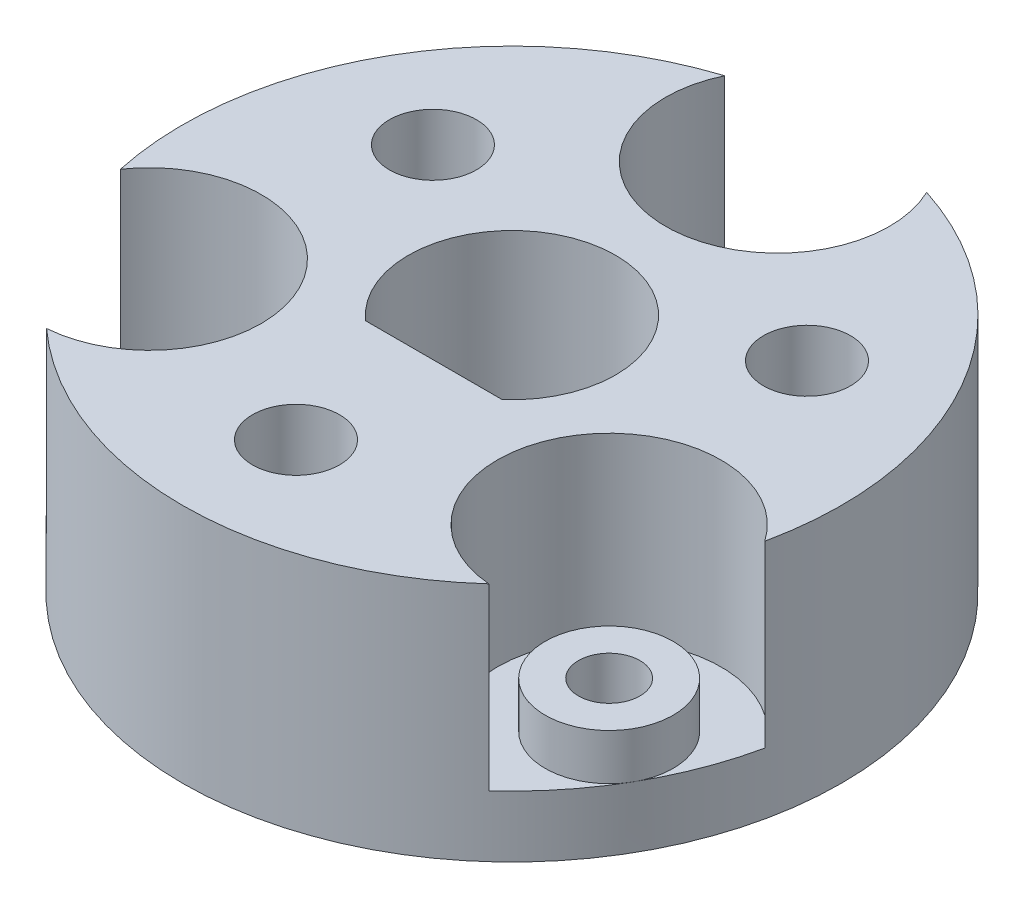
ISO-10303-21;
HEADER;
FILE_DESCRIPTION(('STEP AP214'),'2;1');
FILE_NAME('part.step','',(''),(''),'','','');
FILE_SCHEMA(('AUTOMOTIVE_DESIGN { 1 0 10303 214 1 1 1 1 }'));
ENDSEC;
DATA;
#1=APPLICATION_CONTEXT('core data for automotive mechanical design processes');
#2=APPLICATION_PROTOCOL_DEFINITION('international standard','automotive_design',2000,#1);
#3=PRODUCT_CONTEXT('',#1,'mechanical');
#4=PRODUCT('Part','Part','',(#3));
#5=PRODUCT_RELATED_PRODUCT_CATEGORY('part','',(#4));
#6=PRODUCT_DEFINITION_FORMATION('','',#4);
#7=PRODUCT_DEFINITION_CONTEXT('part definition',#1,'design');
#8=PRODUCT_DEFINITION('design','',#6,#7);
#9=PRODUCT_DEFINITION_SHAPE('','',#8);
#10=(LENGTH_UNIT() NAMED_UNIT(*) SI_UNIT(.MILLI.,.METRE.));
#11=(NAMED_UNIT(*) PLANE_ANGLE_UNIT() SI_UNIT($,.RADIAN.));
#12=(NAMED_UNIT(*) SI_UNIT($,.STERADIAN.) SOLID_ANGLE_UNIT());
#13=UNCERTAINTY_MEASURE_WITH_UNIT(LENGTH_MEASURE(1.E-05),#10,'distance_accuracy_value','');
#14=(GEOMETRIC_REPRESENTATION_CONTEXT(3) GLOBAL_UNCERTAINTY_ASSIGNED_CONTEXT((#13)) GLOBAL_UNIT_ASSIGNED_CONTEXT((#10,
#11,#12)) REPRESENTATION_CONTEXT('',''));
#15=CARTESIAN_POINT('',(0.,0.,0.));
#16=DIRECTION('',(0.,0.,1.));
#17=DIRECTION('',(1.,0.,0.));
#18=AXIS2_PLACEMENT_3D('',#15,#16,#17);
#19=CARTESIAN_POINT('',(0.,3.5,0.));
#20=DIRECTION('',(0.,1.,0.));
#21=DIRECTION('',(0.,0.,1.));
#22=AXIS2_PLACEMENT_3D('',#19,#20,#21);
#23=PLANE('',#22);
#24=CARTESIAN_POINT('',(-3.65246214046086,3.5,-2.10875000000002));
#25=DIRECTION('',(0.,1.,0.));
#26=DIRECTION('',(0.,0.,1.));
#27=AXIS2_PLACEMENT_3D('',#24,#25,#26);
#28=CIRCLE('',#27,0.849999950999999);
#29=CARTESIAN_POINT('',(-3.65246214046086,3.5,-1.25875004900002));
#30=VERTEX_POINT('',#29);
#31=EDGE_CURVE('E49',#30,#30,#28,.T.);
#32=ORIENTED_EDGE('',*,*,#31,.F.);
#33=EDGE_LOOP('',(#32));
#34=FACE_BOUND('',#33,.T.);
#35=CARTESIAN_POINT('',(3.65246214046086,3.5,-2.10875000000002));
#36=DIRECTION('',(0.,1.,0.));
#37=DIRECTION('',(0.,0.,1.));
#38=AXIS2_PLACEMENT_3D('',#35,#36,#37);
#39=CIRCLE('',#38,0.849999950999999);
#40=CARTESIAN_POINT('',(3.65246214046086,3.5,-1.25875004900002));
#41=VERTEX_POINT('',#40);
#42=EDGE_CURVE('E222',#41,#41,#39,.T.);
#43=ORIENTED_EDGE('',*,*,#42,.F.);
#44=EDGE_LOOP('',(#43));
#45=FACE_BOUND('',#44,.T.);
#46=CARTESIAN_POINT('',(0.,3.5,4.2175));
#47=DIRECTION('',(0.,1.,0.));
#48=DIRECTION('',(0.,0.,1.));
#49=AXIS2_PLACEMENT_3D('',#46,#47,#48);
#50=CIRCLE('',#49,0.849999950999999);
#51=CARTESIAN_POINT('',(0.,3.5,5.067499951));
#52=VERTEX_POINT('',#51);
#53=EDGE_CURVE('E132',#52,#52,#50,.T.);
#54=ORIENTED_EDGE('',*,*,#53,.F.);
#55=EDGE_LOOP('',(#54));
#56=FACE_BOUND('',#55,.T.);
#57=CARTESIAN_POINT('',(0.,3.5,0.));
#58=DIRECTION('',(0.,1.,0.));
#59=DIRECTION('',(0.,0.,1.));
#60=AXIS2_PLACEMENT_3D('',#57,#58,#59);
#61=CIRCLE('',#60,6.435);
#62=CARTESIAN_POINT('',(6.29081904106016,3.5,1.3545555701539));
#63=VERTEX_POINT('',#62);
#64=CARTESIAN_POINT('',(1.97232998593911,3.5,-6.1252868852459));
#65=VERTEX_POINT('',#64);
#66=EDGE_CURVE('E180',#63,#65,#61,.T.);
#67=ORIENTED_EDGE('',*,*,#66,.T.);
#68=CARTESIAN_POINT('',(0.,3.5,-5.185));
#69=DIRECTION('',(0.,1.,0.));
#70=DIRECTION('',(0.,0.,1.));
#71=AXIS2_PLACEMENT_3D('',#68,#69,#70);
#72=CIRCLE('',#71,2.185);
#73=CARTESIAN_POINT('',(-1.97232998593911,3.5,-6.1252868852459));
#74=VERTEX_POINT('',#73);
#75=EDGE_CURVE('E182',#74,#65,#72,.T.);
#76=ORIENTED_EDGE('',*,*,#75,.F.);
#77=CARTESIAN_POINT('',(0.,3.5,0.));
#78=DIRECTION('',(0.,1.,0.));
#79=DIRECTION('',(0.,0.,1.));
#80=AXIS2_PLACEMENT_3D('',#77,#78,#79);
#81=CIRCLE('',#80,6.435);
#82=CARTESIAN_POINT('',(-6.29081904106016,3.5,1.35455557015391));
#83=VERTEX_POINT('',#82);
#84=EDGE_CURVE('E186',#74,#83,#81,.T.);
#85=ORIENTED_EDGE('',*,*,#84,.T.);
#86=CARTESIAN_POINT('',(-4.4903417186223,3.5,2.59250000000002));
#87=DIRECTION('',(0.,1.,0.));
#88=DIRECTION('',(0.,0.,1.));
#89=AXIS2_PLACEMENT_3D('',#86,#87,#88);
#90=CIRCLE('',#89,2.185);
#91=CARTESIAN_POINT('',(-4.31848905512103,3.5,4.77073131509204));
#92=VERTEX_POINT('',#91);
#93=EDGE_CURVE('E188',#92,#83,#90,.T.);
#94=ORIENTED_EDGE('',*,*,#93,.F.);
#95=CARTESIAN_POINT('',(0.,3.5,0.));
#96=DIRECTION('',(0.,1.,0.));
#97=DIRECTION('',(0.,0.,1.));
#98=AXIS2_PLACEMENT_3D('',#95,#96,#97);
#99=CIRCLE('',#98,6.435);
#100=CARTESIAN_POINT('',(4.31848905512103,3.5,4.77073131509205));
#101=VERTEX_POINT('',#100);
#102=EDGE_CURVE('E191',#92,#101,#99,.T.);
#103=ORIENTED_EDGE('',*,*,#102,.T.);
#104=CARTESIAN_POINT('',(4.4903417186223,3.5,2.59250000000002));
#105=DIRECTION('',(0.,1.,0.));
#106=DIRECTION('',(0.,0.,1.));
#107=AXIS2_PLACEMENT_3D('',#104,#105,#106);
#108=CIRCLE('',#107,2.185);
#109=EDGE_CURVE('E193',#63,#101,#108,.T.);
#110=ORIENTED_EDGE('',*,*,#109,.F.);
#111=EDGE_LOOP('',(#67,#76,#85,#94,#103,#110));
#112=FACE_BOUND('',#111,.T.);
#113=CARTESIAN_POINT('',(0.,3.5,0.));
#114=DIRECTION('',(0.,1.,0.));
#115=DIRECTION('',(0.,0.,1.));
#116=AXIS2_PLACEMENT_3D('',#113,#114,#115);
#117=CIRCLE('',#116,2.025);
#118=CARTESIAN_POINT('',(1.33229125944742,3.5,1.525));
#119=VERTEX_POINT('',#118);
#120=CARTESIAN_POINT('',(-1.33229125944742,3.5,1.525));
#121=VERTEX_POINT('',#120);
#122=EDGE_CURVE('E123',#119,#121,#117,.T.);
#123=ORIENTED_EDGE('',*,*,#122,.F.);
#124=DIRECTION('',(-1.,0.,0.));
#125=VECTOR('',#124,1.);
#126=CARTESIAN_POINT('',(0.,3.5,1.525));
#127=LINE('',#126,#125);
#128=EDGE_CURVE('E121',#119,#121,#127,.T.);
#129=ORIENTED_EDGE('',*,*,#128,.T.);
#130=EDGE_LOOP('',(#123,#129));
#131=FACE_BOUND('',#130,.T.);
#132=ADVANCED_FACE('F45',(#34,#45,#56,#112,#131),#23,.T.);
#133=CARTESIAN_POINT('',(0.,-1.2,0.));
#134=DIRECTION('',(0.,-1.,0.));
#135=DIRECTION('',(0.,0.,-1.));
#136=AXIS2_PLACEMENT_3D('',#133,#134,#135);
#137=PLANE('',#136);
#138=CARTESIAN_POINT('',(0.,-1.2,0.));
#139=DIRECTION('',(0.,-1.,0.));
#140=DIRECTION('',(0.,0.,-1.));
#141=AXIS2_PLACEMENT_3D('',#138,#139,#140);
#142=CIRCLE('',#141,6.435);
#143=CARTESIAN_POINT('',(0.,-1.2,-6.435));
#144=VERTEX_POINT('',#143);
#145=EDGE_CURVE('E171',#144,#144,#142,.T.);
#146=ORIENTED_EDGE('',*,*,#145,.T.);
#147=EDGE_LOOP('',(#146));
#148=FACE_BOUND('',#147,.T.);
#149=CARTESIAN_POINT('',(0.,-1.2,0.));
#150=DIRECTION('',(0.,-1.,0.));
#151=DIRECTION('',(0.,0.,-1.));
#152=AXIS2_PLACEMENT_3D('',#149,#150,#151);
#153=CIRCLE('',#152,2.025);
#154=CARTESIAN_POINT('',(-1.33229125944742,-1.2,1.525));
#155=VERTEX_POINT('',#154);
#156=CARTESIAN_POINT('',(1.33229125944742,-1.2,1.525));
#157=VERTEX_POINT('',#156);
#158=EDGE_CURVE('E127',#155,#157,#153,.T.);
#159=ORIENTED_EDGE('',*,*,#158,.F.);
#160=DIRECTION('',(1.,0.,0.));
#161=VECTOR('',#160,1.);
#162=CARTESIAN_POINT('',(0.,-1.2,1.525));
#163=LINE('',#162,#161);
#164=EDGE_CURVE('E69',#155,#157,#163,.T.);
#165=ORIENTED_EDGE('',*,*,#164,.T.);
#166=EDGE_LOOP('',(#159,#165));
#167=FACE_BOUND('',#166,.T.);
#168=ADVANCED_FACE('F131',(#148,#167),#137,.T.);
#169=CARTESIAN_POINT('',(0.,3.5,-5.185));
#170=DIRECTION('',(0.,-1.,0.));
#171=DIRECTION('',(0.,0.,-1.));
#172=AXIS2_PLACEMENT_3D('',#169,#170,#171);
#173=CYLINDRICAL_SURFACE('',#172,2.185);
#174=CARTESIAN_POINT('',(0.,0.,-5.185));
#175=DIRECTION('',(0.,1.,0.));
#176=DIRECTION('',(0.,0.,1.));
#177=AXIS2_PLACEMENT_3D('',#174,#175,#176);
#178=CIRCLE('',#177,2.185);
#179=CARTESIAN_POINT('',(-1.97232998593911,0.,-6.1252868852459));
#180=VERTEX_POINT('',#179);
#181=CARTESIAN_POINT('',(1.9723299859391,0.,-6.1252868852459));
#182=VERTEX_POINT('',#181);
#183=EDGE_CURVE('E174',#180,#182,#178,.T.);
#184=ORIENTED_EDGE('',*,*,#183,.F.);
#185=DIRECTION('',(0.,-1.,0.));
#186=VECTOR('',#185,1.);
#187=CARTESIAN_POINT('',(-1.97232998593911,3.5,-6.1252868852459));
#188=LINE('',#187,#186);
#189=EDGE_CURVE('E213',#74,#180,#188,.T.);
#190=ORIENTED_EDGE('',*,*,#189,.F.);
#191=ORIENTED_EDGE('',*,*,#75,.T.);
#192=DIRECTION('',(0.,-1.,0.));
#193=VECTOR('',#192,1.);
#194=CARTESIAN_POINT('',(1.97232998593911,3.5,-6.1252868852459));
#195=LINE('',#194,#193);
#196=EDGE_CURVE('E215',#65,#182,#195,.T.);
#197=ORIENTED_EDGE('',*,*,#196,.T.);
#198=EDGE_LOOP('',(#184,#190,#191,#197));
#199=FACE_BOUND('',#198,.T.);
#200=ADVANCED_FACE('F47',(#199),#173,.F.);
#201=CARTESIAN_POINT('',(-4.4903417186223,3.5,2.59250000000002));
#202=DIRECTION('',(0.,-1.,0.));
#203=DIRECTION('',(0.,0.,-1.));
#204=AXIS2_PLACEMENT_3D('',#201,#202,#203);
#205=CYLINDRICAL_SURFACE('',#204,2.185);
#206=CARTESIAN_POINT('',(-4.4903417186223,0.,2.59250000000002));
#207=DIRECTION('',(0.,1.,0.));
#208=DIRECTION('',(0.,0.,1.));
#209=AXIS2_PLACEMENT_3D('',#206,#207,#208);
#210=CIRCLE('',#209,2.185);
#211=CARTESIAN_POINT('',(-4.31848905512103,0.,4.77073131509204));
#212=VERTEX_POINT('',#211);
#213=CARTESIAN_POINT('',(-6.29081904106016,0.,1.35455557015391));
#214=VERTEX_POINT('',#213);
#215=EDGE_CURVE('E199',#212,#214,#210,.T.);
#216=ORIENTED_EDGE('',*,*,#215,.F.);
#217=DIRECTION('',(0.,-1.,0.));
#218=VECTOR('',#217,1.);
#219=CARTESIAN_POINT('',(-4.31848905512103,3.5,4.77073131509204));
#220=LINE('',#219,#218);
#221=EDGE_CURVE('E208',#92,#212,#220,.T.);
#222=ORIENTED_EDGE('',*,*,#221,.F.);
#223=ORIENTED_EDGE('',*,*,#93,.T.);
#224=DIRECTION('',(0.,-1.,0.));
#225=VECTOR('',#224,1.);
#226=CARTESIAN_POINT('',(-6.29081904106016,3.5,1.35455557015391));
#227=LINE('',#226,#225);
#228=EDGE_CURVE('E210',#83,#214,#227,.T.);
#229=ORIENTED_EDGE('',*,*,#228,.T.);
#230=EDGE_LOOP('',(#216,#222,#223,#229));
#231=FACE_BOUND('',#230,.T.);
#232=ADVANCED_FACE('F269',(#231),#205,.F.);
#233=CARTESIAN_POINT('',(0.,3.5,0.));
#234=DIRECTION('',(0.,-1.,0.));
#235=DIRECTION('',(0.,0.,-1.));
#236=AXIS2_PLACEMENT_3D('',#233,#234,#235);
#237=CYLINDRICAL_SURFACE('',#236,6.435);
#238=ORIENTED_EDGE('',*,*,#221,.T.);
#239=CARTESIAN_POINT('',(0.,0.,0.));
#240=DIRECTION('',(0.,-1.,0.));
#241=DIRECTION('',(0.,0.,-1.));
#242=AXIS2_PLACEMENT_3D('',#239,#240,#241);
#243=CIRCLE('',#242,6.435);
#244=CARTESIAN_POINT('',(-5.57287347335285,0.,3.21750000000003));
#245=VERTEX_POINT('',#244);
#246=EDGE_CURVE('E286',#212,#245,#243,.T.);
#247=ORIENTED_EDGE('',*,*,#246,.T.);
#248=EDGE_CURVE('E179',#245,#214,#243,.T.);
#249=ORIENTED_EDGE('',*,*,#248,.T.);
#250=ORIENTED_EDGE('',*,*,#228,.F.);
#251=ORIENTED_EDGE('',*,*,#84,.F.);
#252=ORIENTED_EDGE('',*,*,#189,.T.);
#253=CARTESIAN_POINT('',(0.,0.,-6.435));
#254=VERTEX_POINT('',#253);
#255=EDGE_CURVE('E176',#180,#254,#243,.T.);
#256=ORIENTED_EDGE('',*,*,#255,.T.);
#257=EDGE_CURVE('E168',#254,#182,#243,.T.);
#258=ORIENTED_EDGE('',*,*,#257,.T.);
#259=ORIENTED_EDGE('',*,*,#196,.F.);
#260=ORIENTED_EDGE('',*,*,#66,.F.);
#261=DIRECTION('',(0.,-1.,0.));
#262=VECTOR('',#261,1.);
#263=CARTESIAN_POINT('',(6.29081904106016,3.5,1.3545555701539));
#264=LINE('',#263,#262);
#265=CARTESIAN_POINT('',(6.29081904106016,0.,1.3545555701539));
#266=VERTEX_POINT('',#265);
#267=EDGE_CURVE('E196',#63,#266,#264,.T.);
#268=ORIENTED_EDGE('',*,*,#267,.T.);
#269=CARTESIAN_POINT('',(5.57287347335285,0.,3.21750000000003));
#270=VERTEX_POINT('',#269);
#271=EDGE_CURVE('E175',#266,#270,#243,.T.);
#272=ORIENTED_EDGE('',*,*,#271,.T.);
#273=CARTESIAN_POINT('',(4.31848905512103,0.,4.77073131509205));
#274=VERTEX_POINT('',#273);
#275=EDGE_CURVE('E288',#270,#274,#243,.T.);
#276=ORIENTED_EDGE('',*,*,#275,.T.);
#277=DIRECTION('',(0.,-1.,0.));
#278=VECTOR('',#277,1.);
#279=CARTESIAN_POINT('',(4.31848905512103,3.5,4.77073131509205));
#280=LINE('',#279,#278);
#281=EDGE_CURVE('E205',#101,#274,#280,.T.);
#282=ORIENTED_EDGE('',*,*,#281,.F.);
#283=ORIENTED_EDGE('',*,*,#102,.F.);
#284=EDGE_LOOP('',(#238,#247,#249,#250,#251,#252,#256,#258,#259,#260,#268,#272,#276,#282,#283));
#285=FACE_BOUND('',#284,.T.);
#286=ORIENTED_EDGE('',*,*,#145,.F.);
#287=EDGE_LOOP('',(#286));
#288=FACE_BOUND('',#287,.T.);
#289=ADVANCED_FACE('F266',(#285,#288),#237,.T.);
#290=CARTESIAN_POINT('',(4.4903417186223,3.5,2.59250000000002));
#291=DIRECTION('',(0.,-1.,0.));
#292=DIRECTION('',(0.,0.,-1.));
#293=AXIS2_PLACEMENT_3D('',#290,#291,#292);
#294=CYLINDRICAL_SURFACE('',#293,2.185);
#295=CARTESIAN_POINT('',(4.4903417186223,0.,2.59250000000002));
#296=DIRECTION('',(0.,1.,0.));
#297=DIRECTION('',(0.,0.,1.));
#298=AXIS2_PLACEMENT_3D('',#295,#296,#297);
#299=CIRCLE('',#298,2.185);
#300=EDGE_CURVE('E183',#266,#274,#299,.T.);
#301=ORIENTED_EDGE('',*,*,#300,.F.);
#302=ORIENTED_EDGE('',*,*,#267,.F.);
#303=ORIENTED_EDGE('',*,*,#109,.T.);
#304=ORIENTED_EDGE('',*,*,#281,.T.);
#305=EDGE_LOOP('',(#301,#302,#303,#304));
#306=FACE_BOUND('',#305,.T.);
#307=ADVANCED_FACE('F263',(#306),#294,.F.);
#308=CARTESIAN_POINT('',(0.,0.,0.));
#309=DIRECTION('',(0.,-1.,0.));
#310=DIRECTION('',(0.,0.,-1.));
#311=AXIS2_PLACEMENT_3D('',#308,#309,#310);
#312=PLANE('',#311);
#313=ORIENTED_EDGE('',*,*,#275,.F.);
#314=CARTESIAN_POINT('',(4.4903417186223,0.,2.59250000000002));
#315=DIRECTION('',(0.,-1.,0.));
#316=DIRECTION('',(0.,0.,-1.));
#317=AXIS2_PLACEMENT_3D('',#314,#315,#316);
#318=CIRCLE('',#317,1.25);
#319=EDGE_CURVE('E150',#270,#270,#318,.T.);
#320=ORIENTED_EDGE('',*,*,#319,.T.);
#321=ORIENTED_EDGE('',*,*,#271,.F.);
#322=ORIENTED_EDGE('',*,*,#300,.T.);
#323=EDGE_LOOP('',(#313,#320,#321,#322));
#324=FACE_BOUND('',#323,.T.);
#325=ADVANCED_FACE('F262',(#324),#312,.F.);
#326=ORIENTED_EDGE('',*,*,#248,.F.);
#327=CARTESIAN_POINT('',(-4.4903417186223,0.,2.59250000000002));
#328=DIRECTION('',(0.,-1.,0.));
#329=DIRECTION('',(0.,0.,-1.));
#330=AXIS2_PLACEMENT_3D('',#327,#328,#329);
#331=CIRCLE('',#330,1.25);
#332=EDGE_CURVE('E159',#245,#245,#331,.T.);
#333=ORIENTED_EDGE('',*,*,#332,.T.);
#334=ORIENTED_EDGE('',*,*,#246,.F.);
#335=ORIENTED_EDGE('',*,*,#215,.T.);
#336=EDGE_LOOP('',(#326,#333,#334,#335));
#337=FACE_BOUND('',#336,.T.);
#338=ADVANCED_FACE('F287',(#337),#312,.F.);
#339=ORIENTED_EDGE('',*,*,#257,.F.);
#340=CARTESIAN_POINT('',(0.,0.,-5.185));
#341=DIRECTION('',(0.,-1.,0.));
#342=DIRECTION('',(0.,0.,-1.));
#343=AXIS2_PLACEMENT_3D('',#340,#341,#342);
#344=CIRCLE('',#343,1.25);
#345=EDGE_CURVE('E143',#254,#254,#344,.T.);
#346=ORIENTED_EDGE('',*,*,#345,.T.);
#347=ORIENTED_EDGE('',*,*,#255,.F.);
#348=ORIENTED_EDGE('',*,*,#183,.T.);
#349=EDGE_LOOP('',(#339,#346,#347,#348));
#350=FACE_BOUND('',#349,.T.);
#351=ADVANCED_FACE('F327',(#350),#312,.F.);
#352=CARTESIAN_POINT('',(-4.4903417186223,0.9,2.59250000000002));
#353=DIRECTION('',(0.,-1.,0.));
#354=DIRECTION('',(0.,0.,-1.));
#355=AXIS2_PLACEMENT_3D('',#352,#353,#354);
#356=CYLINDRICAL_SURFACE('',#355,0.6);
#357=CARTESIAN_POINT('',(-4.4903417186223,0.9,2.59250000000002));
#358=DIRECTION('',(0.,-1.,0.));
#359=DIRECTION('',(0.,0.,-1.));
#360=AXIS2_PLACEMENT_3D('',#357,#358,#359);
#361=CIRCLE('',#360,0.6);
#362=CARTESIAN_POINT('',(-4.4903417186223,0.9,1.99250000000002));
#363=VERTEX_POINT('',#362);
#364=EDGE_CURVE('E162',#363,#363,#361,.T.);
#365=ORIENTED_EDGE('',*,*,#364,.F.);
#366=EDGE_LOOP('',(#365));
#367=FACE_BOUND('',#366,.T.);
#368=CARTESIAN_POINT('',(-4.4903417186223,0.,2.59250000000002));
#369=DIRECTION('',(0.,-1.,0.));
#370=DIRECTION('',(0.,0.,-1.));
#371=AXIS2_PLACEMENT_3D('',#368,#369,#370);
#372=CIRCLE('',#371,0.6);
#373=CARTESIAN_POINT('',(-4.4903417186223,0.,1.99250000000002));
#374=VERTEX_POINT('',#373);
#375=EDGE_CURVE('E218',#374,#374,#372,.T.);
#376=ORIENTED_EDGE('',*,*,#375,.T.);
#377=EDGE_LOOP('',(#376));
#378=FACE_BOUND('',#377,.T.);
#379=ADVANCED_FACE('F324',(#367,#378),#356,.F.);
#380=CARTESIAN_POINT('',(-4.4903417186223,0.9,2.59250000000002));
#381=DIRECTION('',(0.,-1.,0.));
#382=DIRECTION('',(0.,0.,-1.));
#383=AXIS2_PLACEMENT_3D('',#380,#381,#382);
#384=CYLINDRICAL_SURFACE('',#383,1.25);
#385=CARTESIAN_POINT('',(-4.4903417186223,0.9,2.59250000000002));
#386=DIRECTION('',(0.,-1.,0.));
#387=DIRECTION('',(0.,0.,-1.));
#388=AXIS2_PLACEMENT_3D('',#385,#386,#387);
#389=CIRCLE('',#388,1.25);
#390=CARTESIAN_POINT('',(-4.4903417186223,0.9,1.34250000000002));
#391=VERTEX_POINT('',#390);
#392=EDGE_CURVE('E165',#391,#391,#389,.T.);
#393=ORIENTED_EDGE('',*,*,#392,.T.);
#394=EDGE_LOOP('',(#393));
#395=FACE_BOUND('',#394,.T.);
#396=ORIENTED_EDGE('',*,*,#332,.F.);
#397=EDGE_LOOP('',(#396));
#398=FACE_BOUND('',#397,.T.);
#399=ADVANCED_FACE('F320',(#395,#398),#384,.T.);
#400=CARTESIAN_POINT('',(0.,0.9,0.));
#401=DIRECTION('',(0.,-1.,0.));
#402=DIRECTION('',(0.,0.,-1.));
#403=AXIS2_PLACEMENT_3D('',#400,#401,#402);
#404=PLANE('',#403);
#405=ORIENTED_EDGE('',*,*,#364,.T.);
#406=EDGE_LOOP('',(#405));
#407=FACE_BOUND('',#406,.T.);
#408=ORIENTED_EDGE('',*,*,#392,.F.);
#409=EDGE_LOOP('',(#408));
#410=FACE_BOUND('',#409,.T.);
#411=ADVANCED_FACE('F317',(#407,#410),#404,.F.);
#412=ORIENTED_EDGE('',*,*,#375,.F.);
#413=EDGE_LOOP('',(#412));
#414=FACE_BOUND('',#413,.T.);
#415=ADVANCED_FACE('F312',(#414),#312,.F.);
#416=CARTESIAN_POINT('',(4.4903417186223,0.9,2.59250000000002));
#417=DIRECTION('',(0.,-1.,0.));
#418=DIRECTION('',(0.,0.,-1.));
#419=AXIS2_PLACEMENT_3D('',#416,#417,#418);
#420=CYLINDRICAL_SURFACE('',#419,0.6);
#421=CARTESIAN_POINT('',(4.4903417186223,0.9,2.59250000000002));
#422=DIRECTION('',(0.,-1.,0.));
#423=DIRECTION('',(0.,0.,-1.));
#424=AXIS2_PLACEMENT_3D('',#421,#422,#423);
#425=CIRCLE('',#424,0.6);
#426=CARTESIAN_POINT('',(4.4903417186223,0.9,1.99250000000002));
#427=VERTEX_POINT('',#426);
#428=EDGE_CURVE('E153',#427,#427,#425,.T.);
#429=ORIENTED_EDGE('',*,*,#428,.F.);
#430=EDGE_LOOP('',(#429));
#431=FACE_BOUND('',#430,.T.);
#432=CARTESIAN_POINT('',(4.4903417186223,0.,2.59250000000002));
#433=DIRECTION('',(0.,-1.,0.));
#434=DIRECTION('',(0.,0.,-1.));
#435=AXIS2_PLACEMENT_3D('',#432,#433,#434);
#436=CIRCLE('',#435,0.6);
#437=CARTESIAN_POINT('',(4.4903417186223,0.,1.99250000000002));
#438=VERTEX_POINT('',#437);
#439=EDGE_CURVE('E54',#438,#438,#436,.T.);
#440=ORIENTED_EDGE('',*,*,#439,.T.);
#441=EDGE_LOOP('',(#440));
#442=FACE_BOUND('',#441,.T.);
#443=ADVANCED_FACE('F301',(#431,#442),#420,.F.);
#444=CARTESIAN_POINT('',(4.4903417186223,0.9,2.59250000000002));
#445=DIRECTION('',(0.,-1.,0.));
#446=DIRECTION('',(0.,0.,-1.));
#447=AXIS2_PLACEMENT_3D('',#444,#445,#446);
#448=CYLINDRICAL_SURFACE('',#447,1.25);
#449=CARTESIAN_POINT('',(4.4903417186223,0.9,2.59250000000002));
#450=DIRECTION('',(0.,-1.,0.));
#451=DIRECTION('',(0.,0.,-1.));
#452=AXIS2_PLACEMENT_3D('',#449,#450,#451);
#453=CIRCLE('',#452,1.25);
#454=CARTESIAN_POINT('',(4.4903417186223,0.9,1.34250000000002));
#455=VERTEX_POINT('',#454);
#456=EDGE_CURVE('E156',#455,#455,#453,.T.);
#457=ORIENTED_EDGE('',*,*,#456,.T.);
#458=EDGE_LOOP('',(#457));
#459=FACE_BOUND('',#458,.T.);
#460=ORIENTED_EDGE('',*,*,#319,.F.);
#461=EDGE_LOOP('',(#460));
#462=FACE_BOUND('',#461,.T.);
#463=ADVANCED_FACE('F298',(#459,#462),#448,.T.);
#464=CARTESIAN_POINT('',(0.,0.9,0.));
#465=DIRECTION('',(0.,-1.,0.));
#466=DIRECTION('',(0.,0.,-1.));
#467=AXIS2_PLACEMENT_3D('',#464,#465,#466);
#468=PLANE('',#467);
#469=ORIENTED_EDGE('',*,*,#428,.T.);
#470=EDGE_LOOP('',(#469));
#471=FACE_BOUND('',#470,.T.);
#472=ORIENTED_EDGE('',*,*,#456,.F.);
#473=EDGE_LOOP('',(#472));
#474=FACE_BOUND('',#473,.T.);
#475=ADVANCED_FACE('F300',(#471,#474),#468,.F.);
#476=ORIENTED_EDGE('',*,*,#439,.F.);
#477=EDGE_LOOP('',(#476));
#478=FACE_BOUND('',#477,.T.);
#479=ADVANCED_FACE('F309',(#478),#312,.F.);
#480=CARTESIAN_POINT('',(0.,0.9,-5.185));
#481=DIRECTION('',(0.,-1.,0.));
#482=DIRECTION('',(0.,0.,-1.));
#483=AXIS2_PLACEMENT_3D('',#480,#481,#482);
#484=CYLINDRICAL_SURFACE('',#483,0.6);
#485=CARTESIAN_POINT('',(0.,0.9,-5.185));
#486=DIRECTION('',(0.,-1.,0.));
#487=DIRECTION('',(0.,0.,-1.));
#488=AXIS2_PLACEMENT_3D('',#485,#486,#487);
#489=CIRCLE('',#488,0.6);
#490=CARTESIAN_POINT('',(0.,0.9,-5.785));
#491=VERTEX_POINT('',#490);
#492=EDGE_CURVE('E144',#491,#491,#489,.T.);
#493=ORIENTED_EDGE('',*,*,#492,.F.);
#494=EDGE_LOOP('',(#493));
#495=FACE_BOUND('',#494,.T.);
#496=CARTESIAN_POINT('',(0.,0.,-5.185));
#497=DIRECTION('',(0.,-1.,0.));
#498=DIRECTION('',(0.,0.,-1.));
#499=AXIS2_PLACEMENT_3D('',#496,#497,#498);
#500=CIRCLE('',#499,0.6);
#501=CARTESIAN_POINT('',(0.,0.,-5.785));
#502=VERTEX_POINT('',#501);
#503=EDGE_CURVE('E11',#502,#502,#500,.T.);
#504=ORIENTED_EDGE('',*,*,#503,.T.);
#505=EDGE_LOOP('',(#504));
#506=FACE_BOUND('',#505,.T.);
#507=ADVANCED_FACE('F344',(#495,#506),#484,.F.);
#508=CARTESIAN_POINT('',(0.,0.9,-5.185));
#509=DIRECTION('',(0.,-1.,0.));
#510=DIRECTION('',(0.,0.,-1.));
#511=AXIS2_PLACEMENT_3D('',#508,#509,#510);
#512=CYLINDRICAL_SURFACE('',#511,1.25);
#513=CARTESIAN_POINT('',(0.,0.9,-5.185));
#514=DIRECTION('',(0.,-1.,0.));
#515=DIRECTION('',(0.,0.,-1.));
#516=AXIS2_PLACEMENT_3D('',#513,#514,#515);
#517=CIRCLE('',#516,1.25);
#518=CARTESIAN_POINT('',(0.,0.9,-6.435));
#519=VERTEX_POINT('',#518);
#520=EDGE_CURVE('E147',#519,#519,#517,.T.);
#521=ORIENTED_EDGE('',*,*,#520,.T.);
#522=EDGE_LOOP('',(#521));
#523=FACE_BOUND('',#522,.T.);
#524=ORIENTED_EDGE('',*,*,#345,.F.);
#525=EDGE_LOOP('',(#524));
#526=FACE_BOUND('',#525,.T.);
#527=ADVANCED_FACE('F351',(#523,#526),#512,.T.);
#528=CARTESIAN_POINT('',(0.,0.9,0.));
#529=DIRECTION('',(0.,-1.,0.));
#530=DIRECTION('',(0.,0.,-1.));
#531=AXIS2_PLACEMENT_3D('',#528,#529,#530);
#532=PLANE('',#531);
#533=ORIENTED_EDGE('',*,*,#492,.T.);
#534=EDGE_LOOP('',(#533));
#535=FACE_BOUND('',#534,.T.);
#536=ORIENTED_EDGE('',*,*,#520,.F.);
#537=EDGE_LOOP('',(#536));
#538=FACE_BOUND('',#537,.T.);
#539=ADVANCED_FACE('F355',(#535,#538),#532,.F.);
#540=ORIENTED_EDGE('',*,*,#503,.F.);
#541=EDGE_LOOP('',(#540));
#542=FACE_BOUND('',#541,.T.);
#543=ADVANCED_FACE('F346',(#542),#312,.F.);
#544=CARTESIAN_POINT('',(0.,7.5,1.525));
#545=DIRECTION('',(0.,0.,-1.));
#546=DIRECTION('',(-1.,0.,0.));
#547=AXIS2_PLACEMENT_3D('',#544,#545,#546);
#548=PLANE('',#547);
#549=DIRECTION('',(0.,-1.,0.));
#550=VECTOR('',#549,1.);
#551=CARTESIAN_POINT('',(1.33229125944742,7.5,1.525));
#552=LINE('',#551,#550);
#553=EDGE_CURVE('E62',#119,#157,#552,.T.);
#554=ORIENTED_EDGE('',*,*,#553,.T.);
#555=ORIENTED_EDGE('',*,*,#164,.F.);
#556=DIRECTION('',(0.,-1.,0.));
#557=VECTOR('',#556,1.);
#558=CARTESIAN_POINT('',(-1.33229125944742,7.5,1.525));
#559=LINE('',#558,#557);
#560=EDGE_CURVE('E124',#121,#155,#559,.T.);
#561=ORIENTED_EDGE('',*,*,#560,.F.);
#562=ORIENTED_EDGE('',*,*,#128,.F.);
#563=EDGE_LOOP('',(#554,#555,#561,#562));
#564=FACE_BOUND('',#563,.T.);
#565=ADVANCED_FACE('F119',(#564),#548,.T.);
#566=CARTESIAN_POINT('',(0.,7.5,0.));
#567=DIRECTION('',(0.,-1.,0.));
#568=DIRECTION('',(0.,0.,-1.));
#569=AXIS2_PLACEMENT_3D('',#566,#567,#568);
#570=CYLINDRICAL_SURFACE('',#569,2.025);
#571=ORIENTED_EDGE('',*,*,#122,.T.);
#572=ORIENTED_EDGE('',*,*,#560,.T.);
#573=ORIENTED_EDGE('',*,*,#158,.T.);
#574=ORIENTED_EDGE('',*,*,#553,.F.);
#575=EDGE_LOOP('',(#571,#572,#573,#574));
#576=FACE_BOUND('',#575,.T.);
#577=ADVANCED_FACE('F128',(#576),#570,.F.);
#578=CARTESIAN_POINT('',(0.,0.600000000000001,4.2175));
#579=DIRECTION('',(0.,-1.,0.));
#580=DIRECTION('',(0.,0.,-1.));
#581=AXIS2_PLACEMENT_3D('',#578,#579,#580);
#582=PLANE('',#581);
#583=CARTESIAN_POINT('',(0.,0.600000000000001,4.2175));
#584=DIRECTION('',(0.,1.,0.));
#585=DIRECTION('',(0.,0.,1.));
#586=AXIS2_PLACEMENT_3D('',#583,#584,#585);
#587=CIRCLE('',#586,0.849999950999999);
#588=CARTESIAN_POINT('',(0.,0.600000000000001,5.067499951));
#589=VERTEX_POINT('',#588);
#590=EDGE_CURVE('E135',#589,#589,#587,.T.);
#591=ORIENTED_EDGE('',*,*,#590,.T.);
#592=EDGE_LOOP('',(#591));
#593=FACE_BOUND('',#592,.T.);
#594=ADVANCED_FACE('F417',(#593),#582,.F.);
#595=CARTESIAN_POINT('',(0.,4.7,4.2175));
#596=DIRECTION('',(0.,1.,0.));
#597=DIRECTION('',(0.,0.,1.));
#598=AXIS2_PLACEMENT_3D('',#595,#596,#597);
#599=CYLINDRICAL_SURFACE('',#598,0.849999950999999);
#600=ORIENTED_EDGE('',*,*,#53,.T.);
#601=EDGE_LOOP('',(#600));
#602=FACE_BOUND('',#601,.T.);
#603=ORIENTED_EDGE('',*,*,#590,.F.);
#604=EDGE_LOOP('',(#603));
#605=FACE_BOUND('',#604,.T.);
#606=ADVANCED_FACE('F424',(#602,#605),#599,.F.);
#607=CARTESIAN_POINT('',(3.65246214046086,0.600000000000001,-2.10875000000002));
#608=DIRECTION('',(0.,-1.,0.));
#609=DIRECTION('',(0.,0.,-1.));
#610=AXIS2_PLACEMENT_3D('',#607,#608,#609);
#611=PLANE('',#610);
#612=CARTESIAN_POINT('',(3.65246214046086,0.600000000000001,-2.10875000000002));
#613=DIRECTION('',(0.,1.,0.));
#614=DIRECTION('',(0.,0.,1.));
#615=AXIS2_PLACEMENT_3D('',#612,#613,#614);
#616=CIRCLE('',#615,0.849999950999999);
#617=CARTESIAN_POINT('',(3.65246214046086,0.600000000000001,-1.25875004900002));
#618=VERTEX_POINT('',#617);
#619=EDGE_CURVE('E224',#618,#618,#616,.T.);
#620=ORIENTED_EDGE('',*,*,#619,.T.);
#621=EDGE_LOOP('',(#620));
#622=FACE_BOUND('',#621,.T.);
#623=ADVANCED_FACE('F433',(#622),#611,.F.);
#624=CARTESIAN_POINT('',(3.65246214046086,4.7,-2.10875000000002));
#625=DIRECTION('',(0.,1.,0.));
#626=DIRECTION('',(0.,0.,1.));
#627=AXIS2_PLACEMENT_3D('',#624,#625,#626);
#628=CYLINDRICAL_SURFACE('',#627,0.849999950999999);
#629=ORIENTED_EDGE('',*,*,#42,.T.);
#630=EDGE_LOOP('',(#629));
#631=FACE_BOUND('',#630,.T.);
#632=ORIENTED_EDGE('',*,*,#619,.F.);
#633=EDGE_LOOP('',(#632));
#634=FACE_BOUND('',#633,.T.);
#635=ADVANCED_FACE('F247',(#631,#634),#628,.F.);
#636=CARTESIAN_POINT('',(-3.65246214046086,0.600000000000001,-2.10875000000002));
#637=DIRECTION('',(0.,-1.,0.));
#638=DIRECTION('',(0.,0.,-1.));
#639=AXIS2_PLACEMENT_3D('',#636,#637,#638);
#640=PLANE('',#639);
#641=CARTESIAN_POINT('',(-3.65246214046086,0.600000000000001,-2.10875000000002));
#642=DIRECTION('',(0.,1.,0.));
#643=DIRECTION('',(0.,0.,1.));
#644=AXIS2_PLACEMENT_3D('',#641,#642,#643);
#645=CIRCLE('',#644,0.849999950999999);
#646=CARTESIAN_POINT('',(-3.65246214046086,0.600000000000001,-1.25875004900002));
#647=VERTEX_POINT('',#646);
#648=EDGE_CURVE('E232',#647,#647,#645,.T.);
#649=ORIENTED_EDGE('',*,*,#648,.T.);
#650=EDGE_LOOP('',(#649));
#651=FACE_BOUND('',#650,.T.);
#652=ADVANCED_FACE('F237',(#651),#640,.F.);
#653=CARTESIAN_POINT('',(-3.65246214046086,4.7,-2.10875000000002));
#654=DIRECTION('',(0.,1.,0.));
#655=DIRECTION('',(0.,0.,1.));
#656=AXIS2_PLACEMENT_3D('',#653,#654,#655);
#657=CYLINDRICAL_SURFACE('',#656,0.849999950999999);
#658=ORIENTED_EDGE('',*,*,#31,.T.);
#659=EDGE_LOOP('',(#658));
#660=FACE_BOUND('',#659,.T.);
#661=ORIENTED_EDGE('',*,*,#648,.F.);
#662=EDGE_LOOP('',(#661));
#663=FACE_BOUND('',#662,.T.);
#664=ADVANCED_FACE('F239',(#660,#663),#657,.F.);
#665=CLOSED_SHELL('',(#132,#168,#200,#232,#289,#307,#325,#338,#351,#379,#399,#411,#415,#443,
#463,#475,#479,#507,#527,#539,#543,#565,#577,#594,#606,#623,#635,#652,#664));
#666=MANIFOLD_SOLID_BREP('B2',#665);
#667=ADVANCED_BREP_SHAPE_REPRESENTATION('',(#18,#666),#14);
#668=SHAPE_DEFINITION_REPRESENTATION(#9,#667);
ENDSEC;
END-ISO-10303-21;
